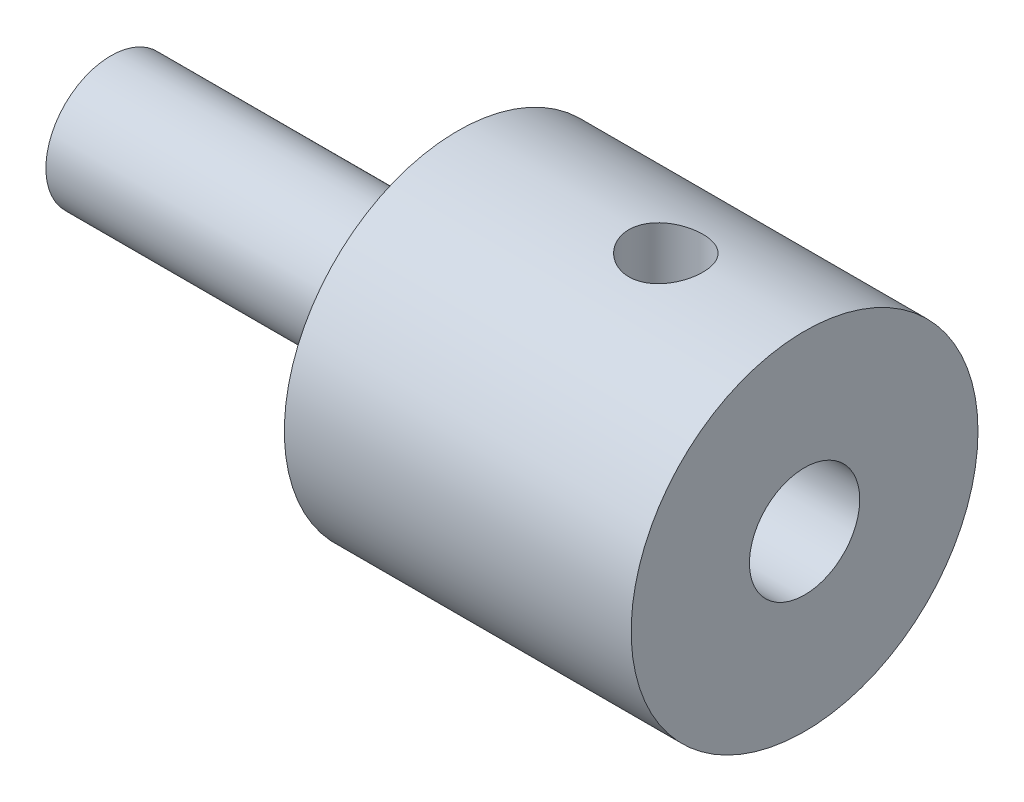
ISO-10303-21;
HEADER;
FILE_DESCRIPTION(('STEP AP214'),'2;1');
FILE_NAME('part.step','',(''),(''),'','','');
FILE_SCHEMA(('AUTOMOTIVE_DESIGN { 1 0 10303 214 1 1 1 1 }'));
ENDSEC;
DATA;
#1=APPLICATION_CONTEXT('core data for automotive mechanical design processes');
#2=APPLICATION_PROTOCOL_DEFINITION('international standard','automotive_design',2000,#1);
#3=PRODUCT_CONTEXT('',#1,'mechanical');
#4=PRODUCT('Part','Part','',(#3));
#5=PRODUCT_RELATED_PRODUCT_CATEGORY('part','',(#4));
#6=PRODUCT_DEFINITION_FORMATION('','',#4);
#7=PRODUCT_DEFINITION_CONTEXT('part definition',#1,'design');
#8=PRODUCT_DEFINITION('design','',#6,#7);
#9=PRODUCT_DEFINITION_SHAPE('','',#8);
#10=(LENGTH_UNIT() NAMED_UNIT(*) SI_UNIT(.MILLI.,.METRE.));
#11=(NAMED_UNIT(*) PLANE_ANGLE_UNIT() SI_UNIT($,.RADIAN.));
#12=(NAMED_UNIT(*) SI_UNIT($,.STERADIAN.) SOLID_ANGLE_UNIT());
#13=UNCERTAINTY_MEASURE_WITH_UNIT(LENGTH_MEASURE(1.E-05),#10,'distance_accuracy_value','');
#14=(GEOMETRIC_REPRESENTATION_CONTEXT(3) GLOBAL_UNCERTAINTY_ASSIGNED_CONTEXT((#13)) GLOBAL_UNIT_ASSIGNED_CONTEXT((#10,
#11,#12)) REPRESENTATION_CONTEXT('',''));
#15=CARTESIAN_POINT('',(0.,0.,0.));
#16=DIRECTION('',(0.,0.,1.));
#17=DIRECTION('',(1.,0.,0.));
#18=AXIS2_PLACEMENT_3D('',#15,#16,#17);
#19=CARTESIAN_POINT('',(25.4,0.,0.));
#20=DIRECTION('',(-1.,0.,0.));
#21=DIRECTION('',(0.,0.,1.));
#22=AXIS2_PLACEMENT_3D('',#19,#20,#21);
#23=CYLINDRICAL_SURFACE('',#22,6.35);
#24=CARTESIAN_POINT('',(12.7,0.,0.));
#25=DIRECTION('',(1.,0.,0.));
#26=DIRECTION('',(0.,0.,-1.));
#27=AXIS2_PLACEMENT_3D('',#24,#25,#26);
#28=CIRCLE('',#27,6.35);
#29=CARTESIAN_POINT('',(12.7,0.,-6.35));
#30=VERTEX_POINT('',#29);
#31=EDGE_CURVE('E100',#30,#30,#28,.T.);
#32=ORIENTED_EDGE('',*,*,#31,.T.);
#33=EDGE_LOOP('',(#32));
#34=FACE_BOUND('',#33,.T.);
#35=CARTESIAN_POINT('',(20.32,6.20428146504493,-1.35255));
#36=CARTESIAN_POINT('',(20.395042839238,6.20428297914018,-1.35254735476959));
#37=CARTESIAN_POINT('',(20.4701179408756,6.20565778806109,-1.34628342286072));
#38=CARTESIAN_POINT('',(20.6181366676521,6.21099901499112,-1.32141855191969));
#39=CARTESIAN_POINT('',(20.6910786575915,6.21496736942756,-1.30280839462845));
#40=CARTESIAN_POINT('',(20.832668512365,6.22502632237694,-1.25386071917447));
#41=CARTESIAN_POINT('',(20.9013208595834,6.23111466038229,-1.22353568865615));
#42=CARTESIAN_POINT('',(21.0325639748478,6.24472486872499,-1.15205435281327));
#43=CARTESIAN_POINT('',(21.0951549343687,6.25224669375721,-1.11089838978295));
#44=CARTESIAN_POINT('',(21.2135032511104,6.26801102198256,-1.01822044449265));
#45=CARTESIAN_POINT('',(21.2691493311533,6.27626233705314,-0.966557837884133));
#46=CARTESIAN_POINT('',(21.3710547059547,6.29247865722836,-0.854636775554536));
#47=CARTESIAN_POINT('',(21.417313294211,6.30044364074661,-0.794377673442264));
#48=CARTESIAN_POINT('',(21.4995681280615,6.31528553891179,-0.66623094711356));
#49=CARTESIAN_POINT('',(21.5354577459641,6.32215084566852,-0.598273420744206));
#50=CARTESIAN_POINT('',(21.5952665861938,6.33392049148851,-0.457121439746286));
#51=CARTESIAN_POINT('',(21.6191870812571,6.33882503903787,-0.383927542873454));
#52=CARTESIAN_POINT('',(21.654029796292,6.34605829158282,-0.235536897936724));
#53=CARTESIAN_POINT('',(21.6651402192001,6.34842425597778,-0.160386187392361));
#54=CARTESIAN_POINT('',(21.6746354455791,6.35044272617813,-0.00925275312612757));
#55=CARTESIAN_POINT('',(21.6730216326599,6.35009552700796,0.0667298792368542));
#56=CARTESIAN_POINT('',(21.6572551784351,6.34675539019339,0.216074189376695));
#57=CARTESIAN_POINT('',(21.6433053528502,6.3438052491452,0.289458376164039));
#58=CARTESIAN_POINT('',(21.6035855782561,6.33563930957093,0.432819744361689));
#59=CARTESIAN_POINT('',(21.5778151133283,6.33042341215516,0.502796776917365));
#60=CARTESIAN_POINT('',(21.5150035320812,6.31824265622307,0.637925354844182));
#61=CARTESIAN_POINT('',(21.4778847282879,6.31126580200665,0.703039663307709));
#62=CARTESIAN_POINT('',(21.3934879221039,6.29632944440402,0.826189588793668));
#63=CARTESIAN_POINT('',(21.3462086028364,6.28836981369978,0.884224286717128));
#64=CARTESIAN_POINT('',(21.2417259778269,6.2721589307865,0.99277305476397));
#65=CARTESIAN_POINT('',(21.1843451599209,6.26390502368011,1.04311600974627));
#66=CARTESIAN_POINT('',(21.0618706861612,6.24818366435631,1.13349527061478));
#67=CARTESIAN_POINT('',(20.996776842536,6.24071623129379,1.17353132550695));
#68=CARTESIAN_POINT('',(20.8604572091279,6.22740683242325,1.24223093709551));
#69=CARTESIAN_POINT('',(20.7892154003272,6.22156929174805,1.27086362187074));
#70=CARTESIAN_POINT('',(20.6427780540152,6.21224298101223,1.31570019502677));
#71=CARTESIAN_POINT('',(20.5675831098145,6.20875385956545,1.33190594285949));
#72=CARTESIAN_POINT('',(20.416933569291,6.20459071570943,1.35116626114797));
#73=CARTESIAN_POINT('',(20.341512177849,6.20386350561664,1.35446934153476));
#74=CARTESIAN_POINT('',(20.1911963438188,6.20516326812262,1.3485020879785));
#75=CARTESIAN_POINT('',(20.1163018673587,6.20719006202768,1.33923256980929));
#76=CARTESIAN_POINT('',(19.9700216606534,6.21371936865718,1.3085984371579));
#77=CARTESIAN_POINT('',(19.8986061833881,6.21819411335528,1.28736940493068));
#78=CARTESIAN_POINT('',(19.760345742406,6.22909030212316,1.23356508178991));
#79=CARTESIAN_POINT('',(19.6935011980333,6.23551192450948,1.20098875152488));
#80=CARTESIAN_POINT('',(19.5652008855997,6.24969599907862,1.12486233116843));
#81=CARTESIAN_POINT('',(19.5038384624959,6.25747672451369,1.08115839478546));
#82=CARTESIAN_POINT('',(19.3892274368388,6.27345351798627,0.984219841330985));
#83=CARTESIAN_POINT('',(19.335979788673,6.28164963472759,0.930984104812946));
#84=CARTESIAN_POINT('',(19.2381522833033,6.29770819401987,0.815371362686176));
#85=CARTESIAN_POINT('',(19.193741416754,6.30556222840786,0.752849999965843));
#86=CARTESIAN_POINT('',(19.1160535060116,6.31989973122006,0.621089703267256));
#87=CARTESIAN_POINT('',(19.0827759569321,6.32638326179053,0.551851074095035));
#88=CARTESIAN_POINT('',(19.0285381268275,6.33721363932065,0.409041107697776));
#89=CARTESIAN_POINT('',(19.0075022091866,6.34157357927463,0.335499534264627));
#90=CARTESIAN_POINT('',(18.9781074063722,6.34772200024534,0.185823491772824));
#91=CARTESIAN_POINT('',(18.9697467784635,6.34951083476356,0.109689380636166));
#92=CARTESIAN_POINT('',(18.9660148369602,6.35030566740446,-0.0414032566452392));
#93=CARTESIAN_POINT('',(18.9703906724416,6.34936583733355,-0.116355365209602));
#94=CARTESIAN_POINT('',(18.9914441622606,6.34492432174151,-0.264429820153297));
#95=CARTESIAN_POINT('',(19.0081216173063,6.34142267772295,-0.337552196155307));
#96=CARTESIAN_POINT('',(19.0531864539922,6.3322542168307,-0.479707852807168));
#97=CARTESIAN_POINT('',(19.0815396856624,6.32659371783376,-0.54875239268107));
#98=CARTESIAN_POINT('',(19.1491172516389,6.31371355636074,-0.681138666104031));
#99=CARTESIAN_POINT('',(19.1883425814092,6.30649375112586,-0.744479876744659));
#100=CARTESIAN_POINT('',(19.2773843336293,6.29112098326684,-0.864900241265064));
#101=CARTESIAN_POINT('',(19.327379557303,6.28295349921313,-0.921845344490507));
#102=CARTESIAN_POINT('',(19.4361790915583,6.26668658077943,-1.02662427704349));
#103=CARTESIAN_POINT('',(19.4949855092258,6.25858716316726,-1.07445592077018));
#104=CARTESIAN_POINT('',(19.62062394892,6.24326070157046,-1.16022535361927));
#105=CARTESIAN_POINT('',(19.6875473192095,6.23604586334246,-1.19803162910014));
#106=CARTESIAN_POINT('',(19.8269354834536,6.22345745590742,-1.26180110156248));
#107=CARTESIAN_POINT('',(19.8993954166598,6.2180822937948,-1.28777455062407));
#108=CARTESIAN_POINT('',(20.0299655729276,6.21080076496729,-1.32237727232254));
#109=CARTESIAN_POINT('',(20.0873554811617,6.20837190944795,-1.33367081236868));
#110=CARTESIAN_POINT('',(20.2031571029051,6.20511170506708,-1.34875804151217));
#111=CARTESIAN_POINT('',(20.2615687714675,6.20428028611238,-1.3525520596777));
#112=CARTESIAN_POINT('',(20.32,6.20428146504493,-1.35255));
#113=B_SPLINE_CURVE_WITH_KNOTS('',3,(#35,#36,#37,#38,#39,#40,#41,#42,#43,#44,#45,#46,#47,#48,
#49,#50,#51,#52,#53,#54,#55,#56,#57,#58,#59,#60,#61,#62,#63,#64,#65,#66,#67,#68,#69,#70,#71,#72,
#73,#74,#75,#76,#77,#78,#79,#80,#81,#82,#83,#84,#85,#86,#87,#88,#89,#90,#91,#92,#93,#94,#95,#96,
#97,#98,#99,#100,#101,#102,#103,#104,#105,#106,#107,#108,#109,#110,#111,#112),.UNSPECIFIED.,.T.,
.F.,(4,2,2,2,2,2,2,2,2,2,2,2,2,2,2,2,2,2,2,2,2,2,2,2,2,2,2,2,2,2,2,2,2,2,2,2,2,2,4),(0.,
0.224914436969695,0.44999699467631,0.674840281381525,0.899676463128616,1.1277475375804,
1.35583577029311,1.58619220951851,1.81652414859102,2.0434271559271,2.2703054905883,
2.49352167317424,2.71674759908276,2.94153724548471,3.16635604385126,3.39561376672707,
3.62487707196822,3.85475690153274,4.08460232728993,4.30999836392228,4.53537977641821,
4.75825607317157,4.98115278956583,5.20731655186002,5.43350689302728,5.66367697281437,
5.89383661316977,6.12255865319634,6.3512492432027,6.57543090537504,6.79960893577981,
7.02313588295607,7.24668330332536,7.47427578777841,7.70192278522312,7.93242289796557,
8.16272292149837,8.33785760045708,8.51298459458863),.UNSPECIFIED.);
#114=CARTESIAN_POINT('',(20.32,6.20428146504493,-1.35255));
#115=VERTEX_POINT('',#114);
#116=EDGE_CURVE('E64',#115,#115,#113,.T.);
#117=ORIENTED_EDGE('',*,*,#116,.T.);
#118=EDGE_LOOP('',(#117));
#119=FACE_BOUND('',#118,.T.);
#120=CARTESIAN_POINT('',(25.4,0.,0.));
#121=DIRECTION('',(1.,0.,0.));
#122=DIRECTION('',(0.,0.,-1.));
#123=AXIS2_PLACEMENT_3D('',#120,#121,#122);
#124=CIRCLE('',#123,6.35);
#125=CARTESIAN_POINT('',(25.4,0.,-6.35));
#126=VERTEX_POINT('',#125);
#127=EDGE_CURVE('E11',#126,#126,#124,.T.);
#128=ORIENTED_EDGE('',*,*,#127,.F.);
#129=EDGE_LOOP('',(#128));
#130=FACE_BOUND('',#129,.T.);
#131=ADVANCED_FACE('F35',(#34,#119,#130),#23,.T.);
#132=CARTESIAN_POINT('',(25.4,0.,0.));
#133=DIRECTION('',(1.,0.,0.));
#134=DIRECTION('',(0.,0.,-1.));
#135=AXIS2_PLACEMENT_3D('',#132,#133,#134);
#136=PLANE('',#135);
#137=CARTESIAN_POINT('',(25.4,0.,0.));
#138=DIRECTION('',(1.,0.,0.));
#139=DIRECTION('',(0.,0.,-1.));
#140=AXIS2_PLACEMENT_3D('',#137,#138,#139);
#141=CIRCLE('',#140,2.01929999999999);
#142=CARTESIAN_POINT('',(25.4,0.,-2.01929999999999));
#143=VERTEX_POINT('',#142);
#144=EDGE_CURVE('E53',#143,#143,#141,.T.);
#145=ORIENTED_EDGE('',*,*,#144,.F.);
#146=EDGE_LOOP('',(#145));
#147=FACE_BOUND('',#146,.T.);
#148=ORIENTED_EDGE('',*,*,#127,.T.);
#149=EDGE_LOOP('',(#148));
#150=FACE_BOUND('',#149,.T.);
#151=ADVANCED_FACE('F48',(#147,#150),#136,.T.);
#152=CARTESIAN_POINT('',(16.3999926,0.,0.));
#153=DIRECTION('',(1.,0.,0.));
#154=DIRECTION('',(0.,0.,-1.));
#155=AXIS2_PLACEMENT_3D('',#152,#153,#154);
#156=CONICAL_SURFACE('',#155,2.0193,1.02974425867665);
#157=CARTESIAN_POINT('',(15.1866747519976,0.,0.));
#158=VERTEX_POINT('',#157);
#159=VERTEX_LOOP('',#158);
#160=FACE_BOUND('',#159,.T.);
#161=CARTESIAN_POINT('',(16.3999926,0.,0.));
#162=DIRECTION('',(1.,0.,0.));
#163=DIRECTION('',(0.,0.,-1.));
#164=AXIS2_PLACEMENT_3D('',#161,#162,#163);
#165=CIRCLE('',#164,2.0193);
#166=CARTESIAN_POINT('',(16.3999926,0.,-2.0193));
#167=VERTEX_POINT('',#166);
#168=EDGE_CURVE('E41',#167,#167,#165,.T.);
#169=ORIENTED_EDGE('',*,*,#168,.T.);
#170=EDGE_LOOP('',(#169));
#171=FACE_BOUND('',#170,.T.);
#172=ADVANCED_FACE('F44',(#160,#171),#156,.F.);
#173=CARTESIAN_POINT('',(25.4,0.,0.));
#174=DIRECTION('',(1.,0.,0.));
#175=DIRECTION('',(0.,0.,-1.));
#176=AXIS2_PLACEMENT_3D('',#173,#174,#175);
#177=CYLINDRICAL_SURFACE('',#176,2.01929999999999);
#178=CARTESIAN_POINT('',(20.32,1.49939353990205,-1.35255));
#179=CARTESIAN_POINT('',(20.2541004087731,1.49940434840804,-1.35254380041712));
#180=CARTESIAN_POINT('',(20.1881515751606,1.50382259731787,-1.34768901249495));
#181=CARTESIAN_POINT('',(20.0586203747452,1.52063637853052,-1.32867751747527));
#182=CARTESIAN_POINT('',(19.9950431646612,1.53304833113077,-1.314501662212));
#183=CARTESIAN_POINT('',(19.8725422120036,1.56361894082947,-1.27797629332162));
#184=CARTESIAN_POINT('',(19.813579031513,1.58172019381091,-1.25570809395549));
#185=CARTESIAN_POINT('',(19.7003264388356,1.62153016132455,-1.20386038892654));
#186=CARTESIAN_POINT('',(19.6460378683645,1.64323952348361,-1.17427957024136));
#187=CARTESIAN_POINT('',(19.5343097028999,1.69191479485549,-1.10323536131488));
#188=CARTESIAN_POINT('',(19.4777193905291,1.71917021004822,-1.06063446266398));
#189=CARTESIAN_POINT('',(19.3717507980569,1.77349653198396,-0.967065961592577));
#190=CARTESIAN_POINT('',(19.3223796945048,1.80056722996343,-0.916090139179481));
#191=CARTESIAN_POINT('',(19.225057930227,1.85614049289306,-0.798219097004072));
#192=CARTESIAN_POINT('',(19.1783732223469,1.88427254705945,-0.730085850808155));
#193=CARTESIAN_POINT('',(19.0975313435529,1.93432289727914,-0.584683649796939));
#194=CARTESIAN_POINT('',(19.0633600885394,1.95624817281529,-0.507425096054491));
#195=CARTESIAN_POINT('',(19.0127328047347,1.98917166857349,-0.355151804583268));
#196=CARTESIAN_POINT('',(18.9947114652308,2.00112457636288,-0.280869760477747));
#197=CARTESIAN_POINT('',(18.9714964703543,2.01657227218721,-0.129498436571044));
#198=CARTESIAN_POINT('',(18.9662864236461,2.02007786797207,-0.0524128720696823));
#199=CARTESIAN_POINT('',(18.9688435388095,2.01836788140776,0.0895408881547877));
#200=CARTESIAN_POINT('',(18.9747420128748,2.01440802841086,0.154468697148765));
#201=CARTESIAN_POINT('',(18.9956314746373,2.0005178321981,0.282177949102503));
#202=CARTESIAN_POINT('',(19.0106231250834,1.99058705379655,0.344959235262298));
#203=CARTESIAN_POINT('',(19.0488618121236,1.96564624647717,0.466525857300001));
#204=CARTESIAN_POINT('',(19.072071434946,1.95065925123114,0.52532788766479));
#205=CARTESIAN_POINT('',(19.1258434877525,1.91670464102705,0.638195419675024));
#206=CARTESIAN_POINT('',(19.1564072383299,1.89773631121212,0.692260068239311));
#207=CARTESIAN_POINT('',(19.2284922472908,1.85435493805526,0.801779402175279));
#208=CARTESIAN_POINT('',(19.2709269463546,1.82955375865744,0.856477363841795));
#209=CARTESIAN_POINT('',(19.3631789589937,1.77826207252142,0.958448230635066));
#210=CARTESIAN_POINT('',(19.4130076818395,1.75176899175345,1.00570942410656));
#211=CARTESIAN_POINT('',(19.527713893912,1.69499965905825,1.09907960384728));
#212=CARTESIAN_POINT('',(19.5937257486945,1.66478294847518,1.14384109128564));
#213=CARTESIAN_POINT('',(19.7339626091151,1.60857705620193,1.22161958976007));
#214=CARTESIAN_POINT('',(19.8081737041258,1.58258089364045,1.25465610376161));
#215=CARTESIAN_POINT('',(19.9413310924404,1.54555608514135,1.29977911769434));
#216=CARTESIAN_POINT('',(19.9985567286291,1.53237306258065,1.31515627826555));
#217=CARTESIAN_POINT('',(20.115542775869,1.51217866490722,1.33833099679276));
#218=CARTESIAN_POINT('',(20.1752986034454,1.50515659168984,1.34614169590406));
#219=CARTESIAN_POINT('',(20.2960254289342,1.4983705888663,1.35369431311021));
#220=CARTESIAN_POINT('',(20.3570007273873,1.49863992320188,1.353399252036));
#221=CARTESIAN_POINT('',(20.4779025827395,1.50647425724831,1.34467019046974));
#222=CARTESIAN_POINT('',(20.5378283918729,1.51404425930276,1.33623060943252));
#223=CARTESIAN_POINT('',(20.6518939855673,1.53471144288397,1.31242568254404));
#224=CARTESIAN_POINT('',(20.7061726807079,1.54750185296761,1.29744192385913));
#225=CARTESIAN_POINT('',(20.8114867105181,1.57707971238789,1.26132340540602));
#226=CARTESIAN_POINT('',(20.8625195018992,1.59387024826095,1.24018389298371));
#227=CARTESIAN_POINT('',(20.9839359314497,1.63843424142879,1.18111491098168));
#228=CARTESIAN_POINT('',(21.0522193080627,1.66767366029887,1.13995560148576));
#229=CARTESIAN_POINT('',(21.1802271196545,1.72770696167432,1.04674977919184));
#230=CARTESIAN_POINT('',(21.2399360008934,1.75850353536278,0.994683892553143));
#231=CARTESIAN_POINT('',(21.3502460085189,1.81863691498855,0.879977797646333));
#232=CARTESIAN_POINT('',(21.4007720167779,1.84796037504405,0.817257844905231));
#233=CARTESIAN_POINT('',(21.4905364329945,1.901854777317,0.682467587180216));
#234=CARTESIAN_POINT('',(21.5297974951729,1.92643522481859,0.610416477332822));
#235=CARTESIAN_POINT('',(21.5880179628152,1.96358546089694,0.475087060321365));
#236=CARTESIAN_POINT('',(21.6095351782279,1.97760455153169,0.413305596365028));
#237=CARTESIAN_POINT('',(21.6435288480064,1.99993583901005,0.286310310177953));
#238=CARTESIAN_POINT('',(21.656011342898,2.00825184868213,0.221098812581812));
#239=CARTESIAN_POINT('',(21.6712758771694,2.01843867211473,0.0888260869881326));
#240=CARTESIAN_POINT('',(21.6740268851633,2.02028886771321,0.0217596278273704));
#241=CARTESIAN_POINT('',(21.6695710690667,2.01730519907374,-0.1118934832221));
#242=CARTESIAN_POINT('',(21.6623635435402,2.01247086400633,-0.178480100980771));
#243=CARTESIAN_POINT('',(21.6390307416601,1.99698584639458,-0.305830758926299));
#244=CARTESIAN_POINT('',(21.6233711078541,1.98663920185109,-0.366719308703054));
#245=CARTESIAN_POINT('',(21.5842001963875,1.96116352276967,-0.484834335472369));
#246=CARTESIAN_POINT('',(21.5606875266963,1.94603364037957,-0.542060161065206));
#247=CARTESIAN_POINT('',(21.5044496570189,1.91065031731657,-0.656397683708508));
#248=CARTESIAN_POINT('',(21.4711268113323,1.89007832163395,-0.71311467252818));
#249=CARTESIAN_POINT('',(21.3972892515601,1.84603758926831,-0.8204197646913));
#250=CARTESIAN_POINT('',(21.356768799484,1.82256654602278,-0.871002923554591));
#251=CARTESIAN_POINT('',(21.2621425603969,1.77031196313712,-0.973336741993325));
#252=CARTESIAN_POINT('',(21.2068985418343,1.74128908056346,-1.02391432610699));
#253=CARTESIAN_POINT('',(21.0885301200316,1.68408214065503,-1.11550661334593));
#254=CARTESIAN_POINT('',(21.025402593083,1.65589842133739,-1.15651750725336));
#255=CARTESIAN_POINT('',(20.9017865011113,1.6074581611413,-1.22273363241225));
#256=CARTESIAN_POINT('',(20.8422911611533,1.58664576122133,-1.24938003789393));
#257=CARTESIAN_POINT('',(20.718685701922,1.55037865397612,-1.29411514387335));
#258=CARTESIAN_POINT('',(20.6545879925878,1.5349101474017,-1.31222593021663));
#259=CARTESIAN_POINT('',(20.5450588033033,1.51557600324735,-1.33444362987136));
#260=CARTESIAN_POINT('',(20.5005369008951,1.50956094924448,-1.34120696433126));
#261=CARTESIAN_POINT('',(20.4106843647595,1.5014662717769,-1.35026197192447));
#262=CARTESIAN_POINT('',(20.3653538443481,1.4993861012019,-1.35255426671716));
#263=CARTESIAN_POINT('',(20.32,1.49939353990205,-1.35255));
#264=B_SPLINE_CURVE_WITH_KNOTS('',3,(#178,#179,#180,#181,#182,#183,#184,#185,#186,#187,#188,
#189,#190,#191,#192,#193,#194,#195,#196,#197,#198,#199,#200,#201,#202,#203,#204,#205,#206,#207,
#208,#209,#210,#211,#212,#213,#214,#215,#216,#217,#218,#219,#220,#221,#222,#223,#224,#225,#226,
#227,#228,#229,#230,#231,#232,#233,#234,#235,#236,#237,#238,#239,#240,#241,#242,#243,#244,#245,
#246,#247,#248,#249,#250,#251,#252,#253,#254,#255,#256,#257,#258,#259,#260,#261,#262,#263),
.UNSPECIFIED.,.T.,.F.,(4,2,2,2,2,2,2,2,2,2,2,2,2,2,2,2,2,2,2,2,2,2,2,2,2,2,2,2,2,2,2,2,2,2,2,2,
2,2,2,2,2,2,4),(0.,0.197488042156287,0.39538305465954,0.591342185970877,0.787336528446657,
1.01418414252226,1.24125575259871,1.50156823101369,1.76158681629331,1.99222790940561,
2.22257375618545,2.41757271673043,2.61258589132753,2.80672241420124,3.00089382455507,
3.22066850644043,3.44078590529781,3.69548459277063,3.94975761436904,4.13115708260429,
4.31224093498318,4.49415104394827,4.67618588449813,4.8487869533339,5.02152163668222,
5.27496864227351,5.52886973394323,5.78476250439876,6.04013699921621,6.24000761707669,
6.43974447964718,6.64011768404859,6.84050500259221,7.03083686411817,7.22120248182578,
7.42718936360725,7.63334120290144,7.87335617493057,8.1134665524383,8.31802494544484,
8.52205109928024,8.65798650329677,8.79390300532363),.UNSPECIFIED.);
#265=CARTESIAN_POINT('',(20.32,1.49939353990205,-1.35255));
#266=VERTEX_POINT('',#265);
#267=EDGE_CURVE('E55',#266,#266,#264,.T.);
#268=ORIENTED_EDGE('',*,*,#267,.T.);
#269=EDGE_LOOP('',(#268));
#270=FACE_BOUND('',#269,.T.);
#271=ORIENTED_EDGE('',*,*,#168,.F.);
#272=EDGE_LOOP('',(#271));
#273=FACE_BOUND('',#272,.T.);
#274=ORIENTED_EDGE('',*,*,#144,.T.);
#275=EDGE_LOOP('',(#274));
#276=FACE_BOUND('',#275,.T.);
#277=ADVANCED_FACE('F47',(#270,#273,#276),#177,.F.);
#278=CARTESIAN_POINT('',(20.32,0.,0.));
#279=DIRECTION('',(0.,-1.,0.));
#280=DIRECTION('',(0.,0.,-1.));
#281=AXIS2_PLACEMENT_3D('',#278,#279,#280);
#282=CYLINDRICAL_SURFACE('',#281,1.35255);
#283=ORIENTED_EDGE('',*,*,#116,.F.);
#284=EDGE_LOOP('',(#283));
#285=FACE_BOUND('',#284,.T.);
#286=ORIENTED_EDGE('',*,*,#267,.F.);
#287=EDGE_LOOP('',(#286));
#288=FACE_BOUND('',#287,.T.);
#289=ADVANCED_FACE('F70',(#285,#288),#282,.F.);
#290=CARTESIAN_POINT('',(25.4,0.,0.));
#291=DIRECTION('',(1.,0.,0.));
#292=DIRECTION('',(0.,0.,-1.));
#293=AXIS2_PLACEMENT_3D('',#290,#291,#292);
#294=CYLINDRICAL_SURFACE('',#293,2.38125);
#295=CARTESIAN_POINT('',(12.7,0.,0.));
#296=DIRECTION('',(1.,0.,0.));
#297=DIRECTION('',(0.,0.,-1.));
#298=AXIS2_PLACEMENT_3D('',#295,#296,#297);
#299=CIRCLE('',#298,2.38125);
#300=CARTESIAN_POINT('',(12.7,0.,-2.38125));
#301=VERTEX_POINT('',#300);
#302=EDGE_CURVE('E108',#301,#301,#299,.T.);
#303=ORIENTED_EDGE('',*,*,#302,.F.);
#304=EDGE_LOOP('',(#303));
#305=FACE_BOUND('',#304,.T.);
#306=CARTESIAN_POINT('',(0.,0.,0.));
#307=DIRECTION('',(1.,0.,0.));
#308=DIRECTION('',(0.,0.,-1.));
#309=AXIS2_PLACEMENT_3D('',#306,#307,#308);
#310=CIRCLE('',#309,2.38125);
#311=CARTESIAN_POINT('',(0.,0.,-2.38125));
#312=VERTEX_POINT('',#311);
#313=EDGE_CURVE('E106',#312,#312,#310,.T.);
#314=ORIENTED_EDGE('',*,*,#313,.T.);
#315=EDGE_LOOP('',(#314));
#316=FACE_BOUND('',#315,.T.);
#317=ADVANCED_FACE('F74',(#305,#316),#294,.T.);
#318=CARTESIAN_POINT('',(12.7,0.,-6.35));
#319=DIRECTION('',(1.,0.,0.));
#320=DIRECTION('',(0.,0.,-1.));
#321=AXIS2_PLACEMENT_3D('',#318,#319,#320);
#322=PLANE('',#321);
#323=ORIENTED_EDGE('',*,*,#31,.F.);
#324=EDGE_LOOP('',(#323));
#325=FACE_BOUND('',#324,.T.);
#326=ORIENTED_EDGE('',*,*,#302,.T.);
#327=EDGE_LOOP('',(#326));
#328=FACE_BOUND('',#327,.T.);
#329=ADVANCED_FACE('F80',(#325,#328),#322,.F.);
#330=CARTESIAN_POINT('',(0.,0.,0.));
#331=DIRECTION('',(1.,0.,0.));
#332=DIRECTION('',(0.,0.,-1.));
#333=AXIS2_PLACEMENT_3D('',#330,#331,#332);
#334=PLANE('',#333);
#335=ORIENTED_EDGE('',*,*,#313,.F.);
#336=EDGE_LOOP('',(#335));
#337=FACE_BOUND('',#336,.T.);
#338=ADVANCED_FACE('F83',(#337),#334,.F.);
#339=CLOSED_SHELL('',(#131,#151,#172,#277,#289,#317,#329,#338));
#340=MANIFOLD_SOLID_BREP('B2',#339);
#341=ADVANCED_BREP_SHAPE_REPRESENTATION('',(#18,#340),#14);
#342=SHAPE_DEFINITION_REPRESENTATION(#9,#341);
ENDSEC;
END-ISO-10303-21;
